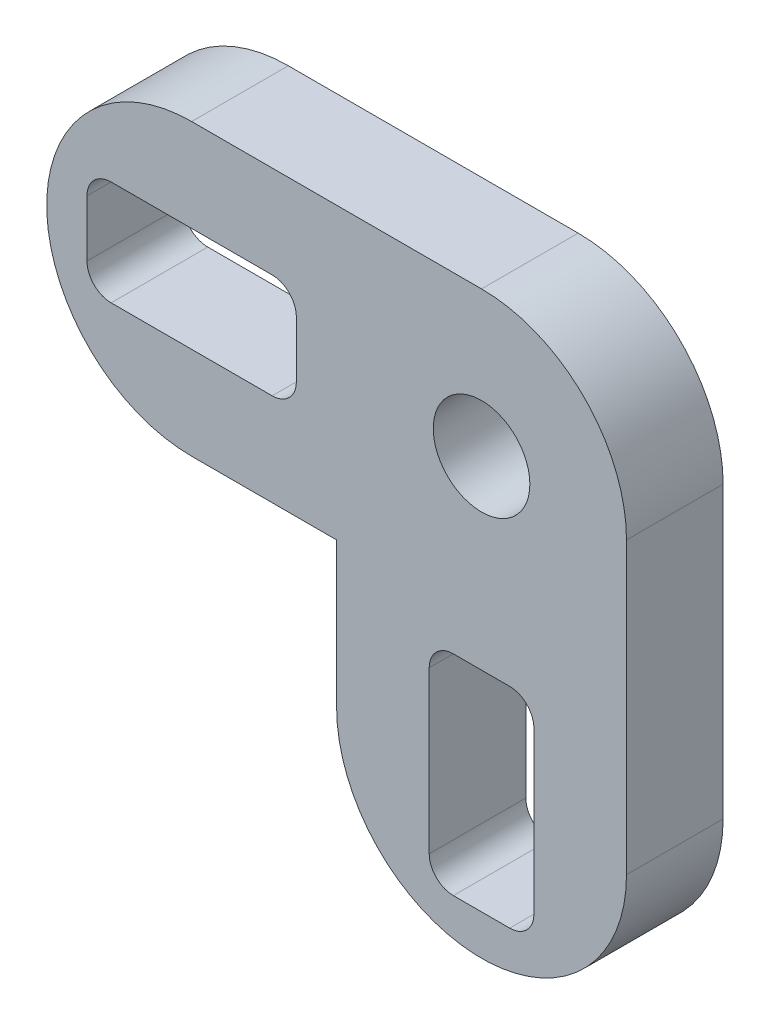
ISO-10303-21;
HEADER;
FILE_DESCRIPTION(('STEP AP214'),'2;1');
FILE_NAME('part.step','',(''),(''),'','','');
FILE_SCHEMA(('AUTOMOTIVE_DESIGN { 1 0 10303 214 1 1 1 1 }'));
ENDSEC;
DATA;
#1=APPLICATION_CONTEXT('core data for automotive mechanical design processes');
#2=APPLICATION_PROTOCOL_DEFINITION('international standard','automotive_design',2000,#1);
#3=PRODUCT_CONTEXT('',#1,'mechanical');
#4=PRODUCT('Part','Part','',(#3));
#5=PRODUCT_RELATED_PRODUCT_CATEGORY('part','',(#4));
#6=PRODUCT_DEFINITION_FORMATION('','',#4);
#7=PRODUCT_DEFINITION_CONTEXT('part definition',#1,'design');
#8=PRODUCT_DEFINITION('design','',#6,#7);
#9=PRODUCT_DEFINITION_SHAPE('','',#8);
#10=(LENGTH_UNIT() NAMED_UNIT(*) SI_UNIT(.MILLI.,.METRE.));
#11=(NAMED_UNIT(*) PLANE_ANGLE_UNIT() SI_UNIT($,.RADIAN.));
#12=(NAMED_UNIT(*) SI_UNIT($,.STERADIAN.) SOLID_ANGLE_UNIT());
#13=UNCERTAINTY_MEASURE_WITH_UNIT(LENGTH_MEASURE(1.E-05),#10,'distance_accuracy_value','');
#14=(GEOMETRIC_REPRESENTATION_CONTEXT(3) GLOBAL_UNCERTAINTY_ASSIGNED_CONTEXT((#13)) GLOBAL_UNIT_ASSIGNED_CONTEXT((#10,
#11,#12)) REPRESENTATION_CONTEXT('',''));
#15=CARTESIAN_POINT('',(0.,0.,0.));
#16=DIRECTION('',(0.,0.,1.));
#17=DIRECTION('',(1.,0.,0.));
#18=AXIS2_PLACEMENT_3D('',#15,#16,#17);
#19=CARTESIAN_POINT('',(149.3421335095,207.323953209,3.));
#20=DIRECTION('',(0.,0.,1.));
#21=DIRECTION('',(1.,0.,0.));
#22=AXIS2_PLACEMENT_3D('',#19,#20,#21);
#23=PLANE('',#22);
#24=DIRECTION('',(0.,-1.,0.));
#25=VECTOR('',#24,1.);
#26=CARTESIAN_POINT('',(156.7171335095,195.823953209,3.));
#27=LINE('',#26,#25);
#28=CARTESIAN_POINT('',(156.7171335095,200.823953209,3.));
#29=VERTEX_POINT('',#28);
#30=CARTESIAN_POINT('',(156.7171335095,195.823953209,3.));
#31=VERTEX_POINT('',#30);
#32=EDGE_CURVE('E255',#29,#31,#27,.T.);
#33=ORIENTED_EDGE('',*,*,#32,.F.);
#34=CARTESIAN_POINT('',(157.4671335095,200.823953209,3.));
#35=DIRECTION('',(0.,0.,1.));
#36=DIRECTION('',(1.,0.,0.));
#37=AXIS2_PLACEMENT_3D('',#34,#35,#36);
#38=CIRCLE('',#37,0.750000000000001);
#39=CARTESIAN_POINT('',(157.4671335095,201.573953209,3.));
#40=VERTEX_POINT('',#39);
#41=EDGE_CURVE('E253',#40,#29,#38,.T.);
#42=ORIENTED_EDGE('',*,*,#41,.F.);
#43=DIRECTION('',(-1.,0.,0.));
#44=VECTOR('',#43,1.);
#45=CARTESIAN_POINT('',(157.4671335095,201.573953209,3.));
#46=LINE('',#45,#44);
#47=CARTESIAN_POINT('',(159.2171335095,201.573953209,3.));
#48=VERTEX_POINT('',#47);
#49=EDGE_CURVE('E269',#48,#40,#46,.T.);
#50=ORIENTED_EDGE('',*,*,#49,.F.);
#51=CARTESIAN_POINT('',(159.2171335095,200.823953209,3.));
#52=DIRECTION('',(0.,0.,1.));
#53=DIRECTION('',(1.,0.,0.));
#54=AXIS2_PLACEMENT_3D('',#51,#52,#53);
#55=CIRCLE('',#54,0.750000000000001);
#56=CARTESIAN_POINT('',(159.9671335095,200.823953209,3.));
#57=VERTEX_POINT('',#56);
#58=EDGE_CURVE('E266',#57,#48,#55,.T.);
#59=ORIENTED_EDGE('',*,*,#58,.F.);
#60=DIRECTION('',(0.,1.,0.));
#61=VECTOR('',#60,1.);
#62=CARTESIAN_POINT('',(159.9671335095,200.823953209,3.));
#63=LINE('',#62,#61);
#64=CARTESIAN_POINT('',(159.9671335095,195.823953209,3.));
#65=VERTEX_POINT('',#64);
#66=EDGE_CURVE('E264',#65,#57,#63,.T.);
#67=ORIENTED_EDGE('',*,*,#66,.F.);
#68=CARTESIAN_POINT('',(159.2171335095,195.823953209,3.));
#69=DIRECTION('',(0.,0.,1.));
#70=DIRECTION('',(1.,0.,0.));
#71=AXIS2_PLACEMENT_3D('',#68,#69,#70);
#72=CIRCLE('',#71,0.750000000000001);
#73=CARTESIAN_POINT('',(159.2171335095,195.073953209,3.));
#74=VERTEX_POINT('',#73);
#75=EDGE_CURVE('E262',#74,#65,#72,.T.);
#76=ORIENTED_EDGE('',*,*,#75,.F.);
#77=DIRECTION('',(1.,0.,0.));
#78=VECTOR('',#77,1.);
#79=CARTESIAN_POINT('',(159.2171335095,195.073953209,3.));
#80=LINE('',#79,#78);
#81=CARTESIAN_POINT('',(157.4671335095,195.073953209,3.));
#82=VERTEX_POINT('',#81);
#83=EDGE_CURVE('E260',#82,#74,#80,.T.);
#84=ORIENTED_EDGE('',*,*,#83,.F.);
#85=CARTESIAN_POINT('',(157.4671335095,195.823953209,3.));
#86=DIRECTION('',(0.,0.,1.));
#87=DIRECTION('',(1.,0.,0.));
#88=AXIS2_PLACEMENT_3D('',#85,#86,#87);
#89=CIRCLE('',#88,0.750000000000001);
#90=EDGE_CURVE('E258',#31,#82,#89,.T.);
#91=ORIENTED_EDGE('',*,*,#90,.F.);
#92=EDGE_LOOP('',(#33,#42,#50,#59,#67,#76,#84,#91));
#93=FACE_BOUND('',#92,.T.);
#94=CARTESIAN_POINT('',(149.3421335095,207.323953209,3.));
#95=DIRECTION('',(0.,0.,1.));
#96=DIRECTION('',(1.,0.,0.));
#97=AXIS2_PLACEMENT_3D('',#94,#95,#96);
#98=CIRCLE('',#97,4.49999999999999);
#99=CARTESIAN_POINT('',(149.3421335095,211.823953209,3.));
#100=VERTEX_POINT('',#99);
#101=CARTESIAN_POINT('',(149.3421335095,202.823953209,3.));
#102=VERTEX_POINT('',#101);
#103=EDGE_CURVE('E318',#100,#102,#98,.T.);
#104=ORIENTED_EDGE('',*,*,#103,.T.);
#105=DIRECTION('',(1.,0.,0.));
#106=VECTOR('',#105,1.);
#107=CARTESIAN_POINT('',(153.8421335095,202.823953209,3.));
#108=LINE('',#107,#106);
#109=CARTESIAN_POINT('',(153.8421335095,202.823953209,3.));
#110=VERTEX_POINT('',#109);
#111=EDGE_CURVE('E321',#102,#110,#108,.T.);
#112=ORIENTED_EDGE('',*,*,#111,.T.);
#113=DIRECTION('',(0.,-1.,0.));
#114=VECTOR('',#113,1.);
#115=CARTESIAN_POINT('',(153.8421335095,198.323953209,3.));
#116=LINE('',#115,#114);
#117=CARTESIAN_POINT('',(153.8421335095,198.323953209,3.));
#118=VERTEX_POINT('',#117);
#119=EDGE_CURVE('E324',#110,#118,#116,.T.);
#120=ORIENTED_EDGE('',*,*,#119,.T.);
#121=CARTESIAN_POINT('',(158.3421335095,198.323953209,3.));
#122=DIRECTION('',(0.,0.,1.));
#123=DIRECTION('',(1.,0.,0.));
#124=AXIS2_PLACEMENT_3D('',#121,#122,#123);
#125=CIRCLE('',#124,4.49999999999999);
#126=CARTESIAN_POINT('',(162.8421335095,198.323953209,3.));
#127=VERTEX_POINT('',#126);
#128=EDGE_CURVE('E326',#118,#127,#125,.T.);
#129=ORIENTED_EDGE('',*,*,#128,.T.);
#130=DIRECTION('',(0.,1.,0.));
#131=VECTOR('',#130,1.);
#132=CARTESIAN_POINT('',(162.8421335095,198.323953209,3.));
#133=LINE('',#132,#131);
#134=CARTESIAN_POINT('',(162.8421335095,207.323953209,3.));
#135=VERTEX_POINT('',#134);
#136=EDGE_CURVE('E328',#127,#135,#133,.T.);
#137=ORIENTED_EDGE('',*,*,#136,.T.);
#138=CARTESIAN_POINT('',(158.3421335095,207.323953209,3.));
#139=DIRECTION('',(0.,0.,1.));
#140=DIRECTION('',(1.,0.,0.));
#141=AXIS2_PLACEMENT_3D('',#138,#139,#140);
#142=CIRCLE('',#141,4.5);
#143=CARTESIAN_POINT('',(158.3421335095,211.823953209,3.));
#144=VERTEX_POINT('',#143);
#145=EDGE_CURVE('E330',#135,#144,#142,.T.);
#146=ORIENTED_EDGE('',*,*,#145,.T.);
#147=DIRECTION('',(-1.,0.,0.));
#148=VECTOR('',#147,1.);
#149=CARTESIAN_POINT('',(149.3421335095,211.823953209,3.));
#150=LINE('',#149,#148);
#151=EDGE_CURVE('E332',#144,#100,#150,.T.);
#152=ORIENTED_EDGE('',*,*,#151,.T.);
#153=EDGE_LOOP('',(#104,#112,#120,#129,#137,#146,#152));
#154=FACE_BOUND('',#153,.T.);
#155=CARTESIAN_POINT('',(158.3421335095,207.323953209,3.));
#156=DIRECTION('',(0.,0.,1.));
#157=DIRECTION('',(1.,0.,0.));
#158=AXIS2_PLACEMENT_3D('',#155,#156,#157);
#159=CIRCLE('',#158,1.5);
#160=CARTESIAN_POINT('',(159.8421335095,207.323953209,3.));
#161=VERTEX_POINT('',#160);
#162=EDGE_CURVE('E312',#161,#161,#159,.T.);
#163=ORIENTED_EDGE('',*,*,#162,.F.);
#164=EDGE_LOOP('',(#163));
#165=FACE_BOUND('',#164,.T.);
#166=DIRECTION('',(1.,0.,0.));
#167=VECTOR('',#166,1.);
#168=CARTESIAN_POINT('',(151.8421335095,205.698953209,3.));
#169=LINE('',#168,#167);
#170=CARTESIAN_POINT('',(146.8421335095,205.698953209,3.));
#171=VERTEX_POINT('',#170);
#172=CARTESIAN_POINT('',(151.8421335095,205.698953209,3.));
#173=VERTEX_POINT('',#172);
#174=EDGE_CURVE('E196',#171,#173,#169,.T.);
#175=ORIENTED_EDGE('',*,*,#174,.F.);
#176=CARTESIAN_POINT('',(146.8421335095,206.448953209,3.));
#177=DIRECTION('',(0.,0.,1.));
#178=DIRECTION('',(1.,0.,0.));
#179=AXIS2_PLACEMENT_3D('',#176,#177,#178);
#180=CIRCLE('',#179,0.750000000000001);
#181=CARTESIAN_POINT('',(146.0921335095,206.448953209,3.));
#182=VERTEX_POINT('',#181);
#183=EDGE_CURVE('E188',#182,#171,#180,.T.);
#184=ORIENTED_EDGE('',*,*,#183,.F.);
#185=DIRECTION('',(0.,-1.,0.));
#186=VECTOR('',#185,1.);
#187=CARTESIAN_POINT('',(146.0921335095,206.448953209,3.));
#188=LINE('',#187,#186);
#189=CARTESIAN_POINT('',(146.0921335095,208.198953209,3.));
#190=VERTEX_POINT('',#189);
#191=EDGE_CURVE('E221',#190,#182,#188,.T.);
#192=ORIENTED_EDGE('',*,*,#191,.F.);
#193=CARTESIAN_POINT('',(146.8421335095,208.198953209,3.));
#194=DIRECTION('',(0.,0.,1.));
#195=DIRECTION('',(1.,0.,0.));
#196=AXIS2_PLACEMENT_3D('',#193,#194,#195);
#197=CIRCLE('',#196,0.750000000000001);
#198=CARTESIAN_POINT('',(146.8421335095,208.948953209,3.));
#199=VERTEX_POINT('',#198);
#200=EDGE_CURVE('E219',#199,#190,#197,.T.);
#201=ORIENTED_EDGE('',*,*,#200,.F.);
#202=DIRECTION('',(-1.,0.,0.));
#203=VECTOR('',#202,1.);
#204=CARTESIAN_POINT('',(146.8421335095,208.948953209,3.));
#205=LINE('',#204,#203);
#206=CARTESIAN_POINT('',(151.8421335095,208.948953209,3.));
#207=VERTEX_POINT('',#206);
#208=EDGE_CURVE('E217',#207,#199,#205,.T.);
#209=ORIENTED_EDGE('',*,*,#208,.F.);
#210=CARTESIAN_POINT('',(151.8421335095,208.198953209,3.));
#211=DIRECTION('',(0.,0.,1.));
#212=DIRECTION('',(1.,0.,0.));
#213=AXIS2_PLACEMENT_3D('',#210,#211,#212);
#214=CIRCLE('',#213,0.750000000000001);
#215=CARTESIAN_POINT('',(152.5921335095,208.198953209,3.));
#216=VERTEX_POINT('',#215);
#217=EDGE_CURVE('E215',#216,#207,#214,.T.);
#218=ORIENTED_EDGE('',*,*,#217,.F.);
#219=DIRECTION('',(0.,1.,0.));
#220=VECTOR('',#219,1.);
#221=CARTESIAN_POINT('',(152.5921335095,208.198953209,3.));
#222=LINE('',#221,#220);
#223=CARTESIAN_POINT('',(152.5921335095,206.448953209,3.));
#224=VERTEX_POINT('',#223);
#225=EDGE_CURVE('E211',#224,#216,#222,.T.);
#226=ORIENTED_EDGE('',*,*,#225,.F.);
#227=CARTESIAN_POINT('',(151.8421335095,206.448953209,3.));
#228=DIRECTION('',(0.,0.,1.));
#229=DIRECTION('',(1.,0.,0.));
#230=AXIS2_PLACEMENT_3D('',#227,#228,#229);
#231=CIRCLE('',#230,0.750000000000001);
#232=EDGE_CURVE('E209',#173,#224,#231,.T.);
#233=ORIENTED_EDGE('',*,*,#232,.F.);
#234=EDGE_LOOP('',(#175,#184,#192,#201,#209,#218,#226,#233));
#235=FACE_BOUND('',#234,.T.);
#236=ADVANCED_FACE('F33',(#93,#154,#165,#235),#23,.T.);
#237=CARTESIAN_POINT('',(149.3421335095,207.323953209,0.));
#238=DIRECTION('',(0.,0.,1.));
#239=DIRECTION('',(1.,0.,0.));
#240=AXIS2_PLACEMENT_3D('',#237,#238,#239);
#241=PLANE('',#240);
#242=CARTESIAN_POINT('',(157.4671335095,200.823953209,0.));
#243=DIRECTION('',(0.,0.,1.));
#244=DIRECTION('',(1.,0.,0.));
#245=AXIS2_PLACEMENT_3D('',#242,#243,#244);
#246=CIRCLE('',#245,0.750000000000001);
#247=CARTESIAN_POINT('',(157.4671335095,201.573953209,0.));
#248=VERTEX_POINT('',#247);
#249=CARTESIAN_POINT('',(156.7171335095,200.823953209,0.));
#250=VERTEX_POINT('',#249);
#251=EDGE_CURVE('E204',#248,#250,#246,.T.);
#252=ORIENTED_EDGE('',*,*,#251,.T.);
#253=DIRECTION('',(0.,-1.,0.));
#254=VECTOR('',#253,1.);
#255=CARTESIAN_POINT('',(156.7171335095,195.823953209,0.));
#256=LINE('',#255,#254);
#257=CARTESIAN_POINT('',(156.7171335095,195.823953209,0.));
#258=VERTEX_POINT('',#257);
#259=EDGE_CURVE('E274',#250,#258,#256,.T.);
#260=ORIENTED_EDGE('',*,*,#259,.T.);
#261=CARTESIAN_POINT('',(157.4671335095,195.823953209,0.));
#262=DIRECTION('',(0.,0.,1.));
#263=DIRECTION('',(1.,0.,0.));
#264=AXIS2_PLACEMENT_3D('',#261,#262,#263);
#265=CIRCLE('',#264,0.750000000000001);
#266=CARTESIAN_POINT('',(157.4671335095,195.073953209,0.));
#267=VERTEX_POINT('',#266);
#268=EDGE_CURVE('E277',#258,#267,#265,.T.);
#269=ORIENTED_EDGE('',*,*,#268,.T.);
#270=DIRECTION('',(1.,0.,0.));
#271=VECTOR('',#270,1.);
#272=CARTESIAN_POINT('',(159.2171335095,195.073953209,0.));
#273=LINE('',#272,#271);
#274=CARTESIAN_POINT('',(159.2171335095,195.073953209,0.));
#275=VERTEX_POINT('',#274);
#276=EDGE_CURVE('E280',#267,#275,#273,.T.);
#277=ORIENTED_EDGE('',*,*,#276,.T.);
#278=CARTESIAN_POINT('',(159.2171335095,195.823953209,0.));
#279=DIRECTION('',(0.,0.,1.));
#280=DIRECTION('',(1.,0.,0.));
#281=AXIS2_PLACEMENT_3D('',#278,#279,#280);
#282=CIRCLE('',#281,0.750000000000001);
#283=CARTESIAN_POINT('',(159.9671335095,195.823953209,0.));
#284=VERTEX_POINT('',#283);
#285=EDGE_CURVE('E283',#275,#284,#282,.T.);
#286=ORIENTED_EDGE('',*,*,#285,.T.);
#287=DIRECTION('',(0.,1.,0.));
#288=VECTOR('',#287,1.);
#289=CARTESIAN_POINT('',(159.9671335095,200.823953209,0.));
#290=LINE('',#289,#288);
#291=CARTESIAN_POINT('',(159.9671335095,200.823953209,0.));
#292=VERTEX_POINT('',#291);
#293=EDGE_CURVE('E286',#284,#292,#290,.T.);
#294=ORIENTED_EDGE('',*,*,#293,.T.);
#295=CARTESIAN_POINT('',(159.2171335095,200.823953209,0.));
#296=DIRECTION('',(0.,0.,1.));
#297=DIRECTION('',(1.,0.,0.));
#298=AXIS2_PLACEMENT_3D('',#295,#296,#297);
#299=CIRCLE('',#298,0.750000000000001);
#300=CARTESIAN_POINT('',(159.2171335095,201.573953209,0.));
#301=VERTEX_POINT('',#300);
#302=EDGE_CURVE('E289',#292,#301,#299,.T.);
#303=ORIENTED_EDGE('',*,*,#302,.T.);
#304=DIRECTION('',(-1.,0.,0.));
#305=VECTOR('',#304,1.);
#306=CARTESIAN_POINT('',(157.4671335095,201.573953209,0.));
#307=LINE('',#306,#305);
#308=EDGE_CURVE('E256',#301,#248,#307,.T.);
#309=ORIENTED_EDGE('',*,*,#308,.T.);
#310=EDGE_LOOP('',(#252,#260,#269,#277,#286,#294,#303,#309));
#311=FACE_BOUND('',#310,.T.);
#312=CARTESIAN_POINT('',(149.3421335095,207.323953209,0.));
#313=DIRECTION('',(0.,0.,1.));
#314=DIRECTION('',(1.,0.,0.));
#315=AXIS2_PLACEMENT_3D('',#312,#313,#314);
#316=CIRCLE('',#315,4.49999999999999);
#317=CARTESIAN_POINT('',(149.3421335095,211.823953209,0.));
#318=VERTEX_POINT('',#317);
#319=CARTESIAN_POINT('',(149.3421335095,202.823953209,0.));
#320=VERTEX_POINT('',#319);
#321=EDGE_CURVE('E315',#318,#320,#316,.T.);
#322=ORIENTED_EDGE('',*,*,#321,.F.);
#323=DIRECTION('',(-1.,0.,0.));
#324=VECTOR('',#323,1.);
#325=CARTESIAN_POINT('',(149.3421335095,211.823953209,0.));
#326=LINE('',#325,#324);
#327=CARTESIAN_POINT('',(158.3421335095,211.823953209,0.));
#328=VERTEX_POINT('',#327);
#329=EDGE_CURVE('E322',#328,#318,#326,.T.);
#330=ORIENTED_EDGE('',*,*,#329,.F.);
#331=CARTESIAN_POINT('',(158.3421335095,207.323953209,0.));
#332=DIRECTION('',(0.,0.,1.));
#333=DIRECTION('',(1.,0.,0.));
#334=AXIS2_PLACEMENT_3D('',#331,#332,#333);
#335=CIRCLE('',#334,4.5);
#336=CARTESIAN_POINT('',(162.8421335095,207.323953209,0.));
#337=VERTEX_POINT('',#336);
#338=EDGE_CURVE('E345',#337,#328,#335,.T.);
#339=ORIENTED_EDGE('',*,*,#338,.F.);
#340=DIRECTION('',(0.,1.,0.));
#341=VECTOR('',#340,1.);
#342=CARTESIAN_POINT('',(162.8421335095,198.323953209,0.));
#343=LINE('',#342,#341);
#344=CARTESIAN_POINT('',(162.8421335095,198.323953209,0.));
#345=VERTEX_POINT('',#344);
#346=EDGE_CURVE('E343',#345,#337,#343,.T.);
#347=ORIENTED_EDGE('',*,*,#346,.F.);
#348=CARTESIAN_POINT('',(158.3421335095,198.323953209,0.));
#349=DIRECTION('',(0.,0.,1.));
#350=DIRECTION('',(1.,0.,0.));
#351=AXIS2_PLACEMENT_3D('',#348,#349,#350);
#352=CIRCLE('',#351,4.49999999999999);
#353=CARTESIAN_POINT('',(153.8421335095,198.323953209,0.));
#354=VERTEX_POINT('',#353);
#355=EDGE_CURVE('E341',#354,#345,#352,.T.);
#356=ORIENTED_EDGE('',*,*,#355,.F.);
#357=DIRECTION('',(0.,-1.,0.));
#358=VECTOR('',#357,1.);
#359=CARTESIAN_POINT('',(153.8421335095,198.323953209,0.));
#360=LINE('',#359,#358);
#361=CARTESIAN_POINT('',(153.8421335095,202.823953209,0.));
#362=VERTEX_POINT('',#361);
#363=EDGE_CURVE('E339',#362,#354,#360,.T.);
#364=ORIENTED_EDGE('',*,*,#363,.F.);
#365=DIRECTION('',(1.,0.,0.));
#366=VECTOR('',#365,1.);
#367=CARTESIAN_POINT('',(153.8421335095,202.823953209,0.));
#368=LINE('',#367,#366);
#369=EDGE_CURVE('E337',#320,#362,#368,.T.);
#370=ORIENTED_EDGE('',*,*,#369,.F.);
#371=EDGE_LOOP('',(#322,#330,#339,#347,#356,#364,#370));
#372=FACE_BOUND('',#371,.T.);
#373=CARTESIAN_POINT('',(158.3421335095,207.323953209,0.));
#374=DIRECTION('',(0.,0.,1.));
#375=DIRECTION('',(1.,0.,0.));
#376=AXIS2_PLACEMENT_3D('',#373,#374,#375);
#377=CIRCLE('',#376,1.5);
#378=CARTESIAN_POINT('',(159.8421335095,207.323953209,0.));
#379=VERTEX_POINT('',#378);
#380=EDGE_CURVE('E311',#379,#379,#377,.T.);
#381=ORIENTED_EDGE('',*,*,#380,.T.);
#382=EDGE_LOOP('',(#381));
#383=FACE_BOUND('',#382,.T.);
#384=CARTESIAN_POINT('',(146.8421335095,206.448953209,0.));
#385=DIRECTION('',(0.,0.,1.));
#386=DIRECTION('',(1.,0.,0.));
#387=AXIS2_PLACEMENT_3D('',#384,#385,#386);
#388=CIRCLE('',#387,0.750000000000001);
#389=CARTESIAN_POINT('',(146.0921335095,206.448953209,0.));
#390=VERTEX_POINT('',#389);
#391=CARTESIAN_POINT('',(146.8421335095,205.698953209,0.));
#392=VERTEX_POINT('',#391);
#393=EDGE_CURVE('E56',#390,#392,#388,.T.);
#394=ORIENTED_EDGE('',*,*,#393,.T.);
#395=DIRECTION('',(1.,0.,0.));
#396=VECTOR('',#395,1.);
#397=CARTESIAN_POINT('',(151.8421335095,205.698953209,0.));
#398=LINE('',#397,#396);
#399=CARTESIAN_POINT('',(151.8421335095,205.698953209,0.));
#400=VERTEX_POINT('',#399);
#401=EDGE_CURVE('E203',#392,#400,#398,.T.);
#402=ORIENTED_EDGE('',*,*,#401,.T.);
#403=CARTESIAN_POINT('',(151.8421335095,206.448953209,0.));
#404=DIRECTION('',(0.,0.,1.));
#405=DIRECTION('',(1.,0.,0.));
#406=AXIS2_PLACEMENT_3D('',#403,#404,#405);
#407=CIRCLE('',#406,0.750000000000001);
#408=CARTESIAN_POINT('',(152.5921335095,206.448953209,0.));
#409=VERTEX_POINT('',#408);
#410=EDGE_CURVE('E225',#400,#409,#407,.T.);
#411=ORIENTED_EDGE('',*,*,#410,.T.);
#412=DIRECTION('',(0.,1.,0.));
#413=VECTOR('',#412,1.);
#414=CARTESIAN_POINT('',(152.5921335095,208.198953209,0.));
#415=LINE('',#414,#413);
#416=CARTESIAN_POINT('',(152.5921335095,208.198953209,0.));
#417=VERTEX_POINT('',#416);
#418=EDGE_CURVE('E228',#409,#417,#415,.T.);
#419=ORIENTED_EDGE('',*,*,#418,.T.);
#420=CARTESIAN_POINT('',(151.8421335095,208.198953209,0.));
#421=DIRECTION('',(0.,0.,1.));
#422=DIRECTION('',(1.,0.,0.));
#423=AXIS2_PLACEMENT_3D('',#420,#421,#422);
#424=CIRCLE('',#423,0.750000000000001);
#425=CARTESIAN_POINT('',(151.8421335095,208.948953209,0.));
#426=VERTEX_POINT('',#425);
#427=EDGE_CURVE('E231',#417,#426,#424,.T.);
#428=ORIENTED_EDGE('',*,*,#427,.T.);
#429=DIRECTION('',(-1.,0.,0.));
#430=VECTOR('',#429,1.);
#431=CARTESIAN_POINT('',(146.8421335095,208.948953209,0.));
#432=LINE('',#431,#430);
#433=CARTESIAN_POINT('',(146.8421335095,208.948953209,0.));
#434=VERTEX_POINT('',#433);
#435=EDGE_CURVE('E234',#426,#434,#432,.T.);
#436=ORIENTED_EDGE('',*,*,#435,.T.);
#437=CARTESIAN_POINT('',(146.8421335095,208.198953209,0.));
#438=DIRECTION('',(0.,0.,1.));
#439=DIRECTION('',(1.,0.,0.));
#440=AXIS2_PLACEMENT_3D('',#437,#438,#439);
#441=CIRCLE('',#440,0.750000000000001);
#442=CARTESIAN_POINT('',(146.0921335095,208.198953209,0.));
#443=VERTEX_POINT('',#442);
#444=EDGE_CURVE('E237',#434,#443,#441,.T.);
#445=ORIENTED_EDGE('',*,*,#444,.T.);
#446=DIRECTION('',(0.,-1.,0.));
#447=VECTOR('',#446,1.);
#448=CARTESIAN_POINT('',(146.0921335095,206.448953209,0.));
#449=LINE('',#448,#447);
#450=EDGE_CURVE('E197',#443,#390,#449,.T.);
#451=ORIENTED_EDGE('',*,*,#450,.T.);
#452=EDGE_LOOP('',(#394,#402,#411,#419,#428,#436,#445,#451));
#453=FACE_BOUND('',#452,.T.);
#454=ADVANCED_FACE('F372',(#311,#372,#383,#453),#241,.F.);
#455=CARTESIAN_POINT('',(149.3421335095,207.323953209,3.));
#456=DIRECTION('',(0.,0.,-1.));
#457=DIRECTION('',(-1.,0.,0.));
#458=AXIS2_PLACEMENT_3D('',#455,#456,#457);
#459=CYLINDRICAL_SURFACE('',#458,4.49999999999999);
#460=ORIENTED_EDGE('',*,*,#321,.T.);
#461=DIRECTION('',(0.,0.,-1.));
#462=VECTOR('',#461,1.);
#463=CARTESIAN_POINT('',(149.3421335095,202.823953209,3.));
#464=LINE('',#463,#462);
#465=EDGE_CURVE('E11',#102,#320,#464,.T.);
#466=ORIENTED_EDGE('',*,*,#465,.F.);
#467=ORIENTED_EDGE('',*,*,#103,.F.);
#468=DIRECTION('',(0.,0.,-1.));
#469=VECTOR('',#468,1.);
#470=CARTESIAN_POINT('',(149.3421335095,211.823953209,3.));
#471=LINE('',#470,#469);
#472=EDGE_CURVE('E334',#100,#318,#471,.T.);
#473=ORIENTED_EDGE('',*,*,#472,.T.);
#474=EDGE_LOOP('',(#460,#466,#467,#473));
#475=FACE_BOUND('',#474,.T.);
#476=ADVANCED_FACE('F35',(#475),#459,.T.);
#477=CARTESIAN_POINT('',(153.8421335095,202.823953209,3.));
#478=DIRECTION('',(0.,1.,0.));
#479=DIRECTION('',(0.,0.,1.));
#480=AXIS2_PLACEMENT_3D('',#477,#478,#479);
#481=PLANE('',#480);
#482=ORIENTED_EDGE('',*,*,#369,.T.);
#483=DIRECTION('',(0.,0.,-1.));
#484=VECTOR('',#483,1.);
#485=CARTESIAN_POINT('',(153.8421335095,202.823953209,3.));
#486=LINE('',#485,#484);
#487=EDGE_CURVE('E41',#110,#362,#486,.T.);
#488=ORIENTED_EDGE('',*,*,#487,.F.);
#489=ORIENTED_EDGE('',*,*,#111,.F.);
#490=ORIENTED_EDGE('',*,*,#465,.T.);
#491=EDGE_LOOP('',(#482,#488,#489,#490));
#492=FACE_BOUND('',#491,.T.);
#493=ADVANCED_FACE('F390',(#492),#481,.F.);
#494=CARTESIAN_POINT('',(153.8421335095,198.323953209,3.));
#495=DIRECTION('',(1.,0.,0.));
#496=DIRECTION('',(0.,0.,-1.));
#497=AXIS2_PLACEMENT_3D('',#494,#495,#496);
#498=PLANE('',#497);
#499=ORIENTED_EDGE('',*,*,#363,.T.);
#500=DIRECTION('',(0.,0.,-1.));
#501=VECTOR('',#500,1.);
#502=CARTESIAN_POINT('',(153.8421335095,198.323953209,3.));
#503=LINE('',#502,#501);
#504=EDGE_CURVE('E359',#118,#354,#503,.T.);
#505=ORIENTED_EDGE('',*,*,#504,.F.);
#506=ORIENTED_EDGE('',*,*,#119,.F.);
#507=ORIENTED_EDGE('',*,*,#487,.T.);
#508=EDGE_LOOP('',(#499,#505,#506,#507));
#509=FACE_BOUND('',#508,.T.);
#510=ADVANCED_FACE('F366',(#509),#498,.F.);
#511=CARTESIAN_POINT('',(158.3421335095,198.323953209,3.));
#512=DIRECTION('',(0.,0.,-1.));
#513=DIRECTION('',(-1.,0.,0.));
#514=AXIS2_PLACEMENT_3D('',#511,#512,#513);
#515=CYLINDRICAL_SURFACE('',#514,4.49999999999999);
#516=ORIENTED_EDGE('',*,*,#355,.T.);
#517=DIRECTION('',(0.,0.,-1.));
#518=VECTOR('',#517,1.);
#519=CARTESIAN_POINT('',(162.8421335095,198.323953209,3.));
#520=LINE('',#519,#518);
#521=EDGE_CURVE('E356',#127,#345,#520,.T.);
#522=ORIENTED_EDGE('',*,*,#521,.F.);
#523=ORIENTED_EDGE('',*,*,#128,.F.);
#524=ORIENTED_EDGE('',*,*,#504,.T.);
#525=EDGE_LOOP('',(#516,#522,#523,#524));
#526=FACE_BOUND('',#525,.T.);
#527=ADVANCED_FACE('F378',(#526),#515,.T.);
#528=CARTESIAN_POINT('',(162.8421335095,198.323953209,3.));
#529=DIRECTION('',(-1.,0.,0.));
#530=DIRECTION('',(0.,0.,1.));
#531=AXIS2_PLACEMENT_3D('',#528,#529,#530);
#532=PLANE('',#531);
#533=ORIENTED_EDGE('',*,*,#346,.T.);
#534=DIRECTION('',(0.,0.,-1.));
#535=VECTOR('',#534,1.);
#536=CARTESIAN_POINT('',(162.8421335095,207.323953209,3.));
#537=LINE('',#536,#535);
#538=EDGE_CURVE('E353',#135,#337,#537,.T.);
#539=ORIENTED_EDGE('',*,*,#538,.F.);
#540=ORIENTED_EDGE('',*,*,#136,.F.);
#541=ORIENTED_EDGE('',*,*,#521,.T.);
#542=EDGE_LOOP('',(#533,#539,#540,#541));
#543=FACE_BOUND('',#542,.T.);
#544=ADVANCED_FACE('F382',(#543),#532,.F.);
#545=CARTESIAN_POINT('',(158.3421335095,207.323953209,3.));
#546=DIRECTION('',(0.,0.,-1.));
#547=DIRECTION('',(-1.,0.,0.));
#548=AXIS2_PLACEMENT_3D('',#545,#546,#547);
#549=CYLINDRICAL_SURFACE('',#548,4.5);
#550=ORIENTED_EDGE('',*,*,#338,.T.);
#551=DIRECTION('',(0.,0.,-1.));
#552=VECTOR('',#551,1.);
#553=CARTESIAN_POINT('',(158.3421335095,211.823953209,3.));
#554=LINE('',#553,#552);
#555=EDGE_CURVE('E350',#144,#328,#554,.T.);
#556=ORIENTED_EDGE('',*,*,#555,.F.);
#557=ORIENTED_EDGE('',*,*,#145,.F.);
#558=ORIENTED_EDGE('',*,*,#538,.T.);
#559=EDGE_LOOP('',(#550,#556,#557,#558));
#560=FACE_BOUND('',#559,.T.);
#561=ADVANCED_FACE('F398',(#560),#549,.T.);
#562=CARTESIAN_POINT('',(149.3421335095,211.823953209,3.));
#563=DIRECTION('',(0.,-1.,0.));
#564=DIRECTION('',(0.,0.,-1.));
#565=AXIS2_PLACEMENT_3D('',#562,#563,#564);
#566=PLANE('',#565);
#567=ORIENTED_EDGE('',*,*,#329,.T.);
#568=ORIENTED_EDGE('',*,*,#472,.F.);
#569=ORIENTED_EDGE('',*,*,#151,.F.);
#570=ORIENTED_EDGE('',*,*,#555,.T.);
#571=EDGE_LOOP('',(#567,#568,#569,#570));
#572=FACE_BOUND('',#571,.T.);
#573=ADVANCED_FACE('F395',(#572),#566,.F.);
#574=CARTESIAN_POINT('',(158.3421335095,207.323953209,3.));
#575=DIRECTION('',(0.,0.,-1.));
#576=DIRECTION('',(-1.,0.,0.));
#577=AXIS2_PLACEMENT_3D('',#574,#575,#576);
#578=CYLINDRICAL_SURFACE('',#577,1.5);
#579=ORIENTED_EDGE('',*,*,#162,.T.);
#580=EDGE_LOOP('',(#579));
#581=FACE_BOUND('',#580,.T.);
#582=ORIENTED_EDGE('',*,*,#380,.F.);
#583=EDGE_LOOP('',(#582));
#584=FACE_BOUND('',#583,.T.);
#585=ADVANCED_FACE('F405',(#581,#584),#578,.F.);
#586=CARTESIAN_POINT('',(157.4671335095,200.823953209,3.));
#587=DIRECTION('',(0.,0.,-1.));
#588=DIRECTION('',(-1.,0.,0.));
#589=AXIS2_PLACEMENT_3D('',#586,#587,#588);
#590=CYLINDRICAL_SURFACE('',#589,0.750000000000001);
#591=ORIENTED_EDGE('',*,*,#251,.F.);
#592=DIRECTION('',(0.,0.,-1.));
#593=VECTOR('',#592,1.);
#594=CARTESIAN_POINT('',(157.4671335095,201.573953209,3.));
#595=LINE('',#594,#593);
#596=EDGE_CURVE('E271',#40,#248,#595,.T.);
#597=ORIENTED_EDGE('',*,*,#596,.F.);
#598=ORIENTED_EDGE('',*,*,#41,.T.);
#599=DIRECTION('',(0.,0.,-1.));
#600=VECTOR('',#599,1.);
#601=CARTESIAN_POINT('',(156.7171335095,200.823953209,3.));
#602=LINE('',#601,#600);
#603=EDGE_CURVE('E308',#29,#250,#602,.T.);
#604=ORIENTED_EDGE('',*,*,#603,.T.);
#605=EDGE_LOOP('',(#591,#597,#598,#604));
#606=FACE_BOUND('',#605,.T.);
#607=ADVANCED_FACE('F420',(#606),#590,.F.);
#608=CARTESIAN_POINT('',(156.7171335095,195.823953209,3.));
#609=DIRECTION('',(1.,0.,0.));
#610=DIRECTION('',(0.,0.,-1.));
#611=AXIS2_PLACEMENT_3D('',#608,#609,#610);
#612=PLANE('',#611);
#613=ORIENTED_EDGE('',*,*,#259,.F.);
#614=ORIENTED_EDGE('',*,*,#603,.F.);
#615=ORIENTED_EDGE('',*,*,#32,.T.);
#616=DIRECTION('',(0.,0.,-1.));
#617=VECTOR('',#616,1.);
#618=CARTESIAN_POINT('',(156.7171335095,195.823953209,3.));
#619=LINE('',#618,#617);
#620=EDGE_CURVE('E306',#31,#258,#619,.T.);
#621=ORIENTED_EDGE('',*,*,#620,.T.);
#622=EDGE_LOOP('',(#613,#614,#615,#621));
#623=FACE_BOUND('',#622,.T.);
#624=ADVANCED_FACE('F424',(#623),#612,.T.);
#625=CARTESIAN_POINT('',(157.4671335095,195.823953209,3.));
#626=DIRECTION('',(0.,0.,-1.));
#627=DIRECTION('',(-1.,0.,0.));
#628=AXIS2_PLACEMENT_3D('',#625,#626,#627);
#629=CYLINDRICAL_SURFACE('',#628,0.750000000000001);
#630=ORIENTED_EDGE('',*,*,#268,.F.);
#631=ORIENTED_EDGE('',*,*,#620,.F.);
#632=ORIENTED_EDGE('',*,*,#90,.T.);
#633=DIRECTION('',(0.,0.,-1.));
#634=VECTOR('',#633,1.);
#635=CARTESIAN_POINT('',(157.4671335095,195.073953209,3.));
#636=LINE('',#635,#634);
#637=EDGE_CURVE('E304',#82,#267,#636,.T.);
#638=ORIENTED_EDGE('',*,*,#637,.T.);
#639=EDGE_LOOP('',(#630,#631,#632,#638));
#640=FACE_BOUND('',#639,.T.);
#641=ADVANCED_FACE('F428',(#640),#629,.F.);
#642=CARTESIAN_POINT('',(159.2171335095,195.073953209,3.));
#643=DIRECTION('',(0.,1.,0.));
#644=DIRECTION('',(0.,0.,1.));
#645=AXIS2_PLACEMENT_3D('',#642,#643,#644);
#646=PLANE('',#645);
#647=ORIENTED_EDGE('',*,*,#276,.F.);
#648=ORIENTED_EDGE('',*,*,#637,.F.);
#649=ORIENTED_EDGE('',*,*,#83,.T.);
#650=DIRECTION('',(0.,0.,-1.));
#651=VECTOR('',#650,1.);
#652=CARTESIAN_POINT('',(159.2171335095,195.073953209,3.));
#653=LINE('',#652,#651);
#654=EDGE_CURVE('E302',#74,#275,#653,.T.);
#655=ORIENTED_EDGE('',*,*,#654,.T.);
#656=EDGE_LOOP('',(#647,#648,#649,#655));
#657=FACE_BOUND('',#656,.T.);
#658=ADVANCED_FACE('F432',(#657),#646,.T.);
#659=CARTESIAN_POINT('',(159.2171335095,195.823953209,3.));
#660=DIRECTION('',(0.,0.,-1.));
#661=DIRECTION('',(-1.,0.,0.));
#662=AXIS2_PLACEMENT_3D('',#659,#660,#661);
#663=CYLINDRICAL_SURFACE('',#662,0.750000000000001);
#664=ORIENTED_EDGE('',*,*,#285,.F.);
#665=ORIENTED_EDGE('',*,*,#654,.F.);
#666=ORIENTED_EDGE('',*,*,#75,.T.);
#667=DIRECTION('',(0.,0.,-1.));
#668=VECTOR('',#667,1.);
#669=CARTESIAN_POINT('',(159.9671335095,195.823953209,3.));
#670=LINE('',#669,#668);
#671=EDGE_CURVE('E300',#65,#284,#670,.T.);
#672=ORIENTED_EDGE('',*,*,#671,.T.);
#673=EDGE_LOOP('',(#664,#665,#666,#672));
#674=FACE_BOUND('',#673,.T.);
#675=ADVANCED_FACE('F436',(#674),#663,.F.);
#676=CARTESIAN_POINT('',(159.9671335095,200.823953209,3.));
#677=DIRECTION('',(-1.,0.,0.));
#678=DIRECTION('',(0.,0.,1.));
#679=AXIS2_PLACEMENT_3D('',#676,#677,#678);
#680=PLANE('',#679);
#681=ORIENTED_EDGE('',*,*,#293,.F.);
#682=ORIENTED_EDGE('',*,*,#671,.F.);
#683=ORIENTED_EDGE('',*,*,#66,.T.);
#684=DIRECTION('',(0.,0.,-1.));
#685=VECTOR('',#684,1.);
#686=CARTESIAN_POINT('',(159.9671335095,200.823953209,3.));
#687=LINE('',#686,#685);
#688=EDGE_CURVE('E298',#57,#292,#687,.T.);
#689=ORIENTED_EDGE('',*,*,#688,.T.);
#690=EDGE_LOOP('',(#681,#682,#683,#689));
#691=FACE_BOUND('',#690,.T.);
#692=ADVANCED_FACE('F440',(#691),#680,.T.);
#693=CARTESIAN_POINT('',(159.2171335095,200.823953209,3.));
#694=DIRECTION('',(0.,0.,-1.));
#695=DIRECTION('',(-1.,0.,0.));
#696=AXIS2_PLACEMENT_3D('',#693,#694,#695);
#697=CYLINDRICAL_SURFACE('',#696,0.750000000000001);
#698=ORIENTED_EDGE('',*,*,#302,.F.);
#699=ORIENTED_EDGE('',*,*,#688,.F.);
#700=ORIENTED_EDGE('',*,*,#58,.T.);
#701=DIRECTION('',(0.,0.,-1.));
#702=VECTOR('',#701,1.);
#703=CARTESIAN_POINT('',(159.2171335095,201.573953209,3.));
#704=LINE('',#703,#702);
#705=EDGE_CURVE('E296',#48,#301,#704,.T.);
#706=ORIENTED_EDGE('',*,*,#705,.T.);
#707=EDGE_LOOP('',(#698,#699,#700,#706));
#708=FACE_BOUND('',#707,.T.);
#709=ADVANCED_FACE('F444',(#708),#697,.F.);
#710=CARTESIAN_POINT('',(157.4671335095,201.573953209,3.));
#711=DIRECTION('',(0.,-1.,0.));
#712=DIRECTION('',(0.,0.,-1.));
#713=AXIS2_PLACEMENT_3D('',#710,#711,#712);
#714=PLANE('',#713);
#715=ORIENTED_EDGE('',*,*,#308,.F.);
#716=ORIENTED_EDGE('',*,*,#705,.F.);
#717=ORIENTED_EDGE('',*,*,#49,.T.);
#718=ORIENTED_EDGE('',*,*,#596,.T.);
#719=EDGE_LOOP('',(#715,#716,#717,#718));
#720=FACE_BOUND('',#719,.T.);
#721=ADVANCED_FACE('F448',(#720),#714,.T.);
#722=CARTESIAN_POINT('',(146.8421335095,206.448953209,3.));
#723=DIRECTION('',(0.,0.,-1.));
#724=DIRECTION('',(-1.,0.,0.));
#725=AXIS2_PLACEMENT_3D('',#722,#723,#724);
#726=CYLINDRICAL_SURFACE('',#725,0.750000000000001);
#727=ORIENTED_EDGE('',*,*,#393,.F.);
#728=DIRECTION('',(0.,0.,-1.));
#729=VECTOR('',#728,1.);
#730=CARTESIAN_POINT('',(146.0921335095,206.448953209,3.));
#731=LINE('',#730,#729);
#732=EDGE_CURVE('E192',#182,#390,#731,.T.);
#733=ORIENTED_EDGE('',*,*,#732,.F.);
#734=ORIENTED_EDGE('',*,*,#183,.T.);
#735=DIRECTION('',(0.,0.,-1.));
#736=VECTOR('',#735,1.);
#737=CARTESIAN_POINT('',(146.8421335095,205.698953209,3.));
#738=LINE('',#737,#736);
#739=EDGE_CURVE('E191',#171,#392,#738,.T.);
#740=ORIENTED_EDGE('',*,*,#739,.T.);
#741=EDGE_LOOP('',(#727,#733,#734,#740));
#742=FACE_BOUND('',#741,.T.);
#743=ADVANCED_FACE('F190',(#742),#726,.F.);
#744=CARTESIAN_POINT('',(151.8421335095,205.698953209,3.));
#745=DIRECTION('',(0.,1.,0.));
#746=DIRECTION('',(0.,0.,1.));
#747=AXIS2_PLACEMENT_3D('',#744,#745,#746);
#748=PLANE('',#747);
#749=ORIENTED_EDGE('',*,*,#401,.F.);
#750=ORIENTED_EDGE('',*,*,#739,.F.);
#751=ORIENTED_EDGE('',*,*,#174,.T.);
#752=DIRECTION('',(0.,0.,-1.));
#753=VECTOR('',#752,1.);
#754=CARTESIAN_POINT('',(151.8421335095,205.698953209,3.));
#755=LINE('',#754,#753);
#756=EDGE_CURVE('E205',#173,#400,#755,.T.);
#757=ORIENTED_EDGE('',*,*,#756,.T.);
#758=EDGE_LOOP('',(#749,#750,#751,#757));
#759=FACE_BOUND('',#758,.T.);
#760=ADVANCED_FACE('F200',(#759),#748,.T.);
#761=CARTESIAN_POINT('',(151.8421335095,206.448953209,3.));
#762=DIRECTION('',(0.,0.,-1.));
#763=DIRECTION('',(-1.,0.,0.));
#764=AXIS2_PLACEMENT_3D('',#761,#762,#763);
#765=CYLINDRICAL_SURFACE('',#764,0.750000000000001);
#766=ORIENTED_EDGE('',*,*,#410,.F.);
#767=ORIENTED_EDGE('',*,*,#756,.F.);
#768=ORIENTED_EDGE('',*,*,#232,.T.);
#769=DIRECTION('',(0.,0.,-1.));
#770=VECTOR('',#769,1.);
#771=CARTESIAN_POINT('',(152.5921335095,206.448953209,3.));
#772=LINE('',#771,#770);
#773=EDGE_CURVE('E250',#224,#409,#772,.T.);
#774=ORIENTED_EDGE('',*,*,#773,.T.);
#775=EDGE_LOOP('',(#766,#767,#768,#774));
#776=FACE_BOUND('',#775,.T.);
#777=ADVANCED_FACE('F457',(#776),#765,.F.);
#778=CARTESIAN_POINT('',(152.5921335095,208.198953209,3.));
#779=DIRECTION('',(-1.,0.,0.));
#780=DIRECTION('',(0.,0.,1.));
#781=AXIS2_PLACEMENT_3D('',#778,#779,#780);
#782=PLANE('',#781);
#783=ORIENTED_EDGE('',*,*,#418,.F.);
#784=ORIENTED_EDGE('',*,*,#773,.F.);
#785=ORIENTED_EDGE('',*,*,#225,.T.);
#786=DIRECTION('',(0.,0.,-1.));
#787=VECTOR('',#786,1.);
#788=CARTESIAN_POINT('',(152.5921335095,208.198953209,3.));
#789=LINE('',#788,#787);
#790=EDGE_CURVE('E248',#216,#417,#789,.T.);
#791=ORIENTED_EDGE('',*,*,#790,.T.);
#792=EDGE_LOOP('',(#783,#784,#785,#791));
#793=FACE_BOUND('',#792,.T.);
#794=ADVANCED_FACE('F460',(#793),#782,.T.);
#795=CARTESIAN_POINT('',(151.8421335095,208.198953209,3.));
#796=DIRECTION('',(0.,0.,-1.));
#797=DIRECTION('',(-1.,0.,0.));
#798=AXIS2_PLACEMENT_3D('',#795,#796,#797);
#799=CYLINDRICAL_SURFACE('',#798,0.750000000000001);
#800=ORIENTED_EDGE('',*,*,#427,.F.);
#801=ORIENTED_EDGE('',*,*,#790,.F.);
#802=ORIENTED_EDGE('',*,*,#217,.T.);
#803=DIRECTION('',(0.,0.,-1.));
#804=VECTOR('',#803,1.);
#805=CARTESIAN_POINT('',(151.8421335095,208.948953209,3.));
#806=LINE('',#805,#804);
#807=EDGE_CURVE('E246',#207,#426,#806,.T.);
#808=ORIENTED_EDGE('',*,*,#807,.T.);
#809=EDGE_LOOP('',(#800,#801,#802,#808));
#810=FACE_BOUND('',#809,.T.);
#811=ADVANCED_FACE('F464',(#810),#799,.F.);
#812=CARTESIAN_POINT('',(146.8421335095,208.948953209,3.));
#813=DIRECTION('',(0.,-1.,0.));
#814=DIRECTION('',(0.,0.,-1.));
#815=AXIS2_PLACEMENT_3D('',#812,#813,#814);
#816=PLANE('',#815);
#817=ORIENTED_EDGE('',*,*,#435,.F.);
#818=ORIENTED_EDGE('',*,*,#807,.F.);
#819=ORIENTED_EDGE('',*,*,#208,.T.);
#820=DIRECTION('',(0.,0.,-1.));
#821=VECTOR('',#820,1.);
#822=CARTESIAN_POINT('',(146.8421335095,208.948953209,3.));
#823=LINE('',#822,#821);
#824=EDGE_CURVE('E244',#199,#434,#823,.T.);
#825=ORIENTED_EDGE('',*,*,#824,.T.);
#826=EDGE_LOOP('',(#817,#818,#819,#825));
#827=FACE_BOUND('',#826,.T.);
#828=ADVANCED_FACE('F468',(#827),#816,.T.);
#829=CARTESIAN_POINT('',(146.8421335095,208.198953209,3.));
#830=DIRECTION('',(0.,0.,-1.));
#831=DIRECTION('',(-1.,0.,0.));
#832=AXIS2_PLACEMENT_3D('',#829,#830,#831);
#833=CYLINDRICAL_SURFACE('',#832,0.750000000000001);
#834=ORIENTED_EDGE('',*,*,#444,.F.);
#835=ORIENTED_EDGE('',*,*,#824,.F.);
#836=ORIENTED_EDGE('',*,*,#200,.T.);
#837=DIRECTION('',(0.,0.,-1.));
#838=VECTOR('',#837,1.);
#839=CARTESIAN_POINT('',(146.0921335095,208.198953209,3.));
#840=LINE('',#839,#838);
#841=EDGE_CURVE('E48',#190,#443,#840,.T.);
#842=ORIENTED_EDGE('',*,*,#841,.T.);
#843=EDGE_LOOP('',(#834,#835,#836,#842));
#844=FACE_BOUND('',#843,.T.);
#845=ADVANCED_FACE('F472',(#844),#833,.F.);
#846=CARTESIAN_POINT('',(146.0921335095,206.448953209,3.));
#847=DIRECTION('',(1.,0.,0.));
#848=DIRECTION('',(0.,0.,-1.));
#849=AXIS2_PLACEMENT_3D('',#846,#847,#848);
#850=PLANE('',#849);
#851=ORIENTED_EDGE('',*,*,#450,.F.);
#852=ORIENTED_EDGE('',*,*,#841,.F.);
#853=ORIENTED_EDGE('',*,*,#191,.T.);
#854=ORIENTED_EDGE('',*,*,#732,.T.);
#855=EDGE_LOOP('',(#851,#852,#853,#854));
#856=FACE_BOUND('',#855,.T.);
#857=ADVANCED_FACE('F476',(#856),#850,.T.);
#858=CLOSED_SHELL('',(#236,#454,#476,#493,#510,#527,#544,#561,#573,#585,#607,#624,#641,#658,
#675,#692,#709,#721,#743,#760,#777,#794,#811,#828,#845,#857));
#859=MANIFOLD_SOLID_BREP('B2',#858);
#860=ADVANCED_BREP_SHAPE_REPRESENTATION('',(#18,#859),#14);
#861=SHAPE_DEFINITION_REPRESENTATION(#9,#860);
ENDSEC;
END-ISO-10303-21;
